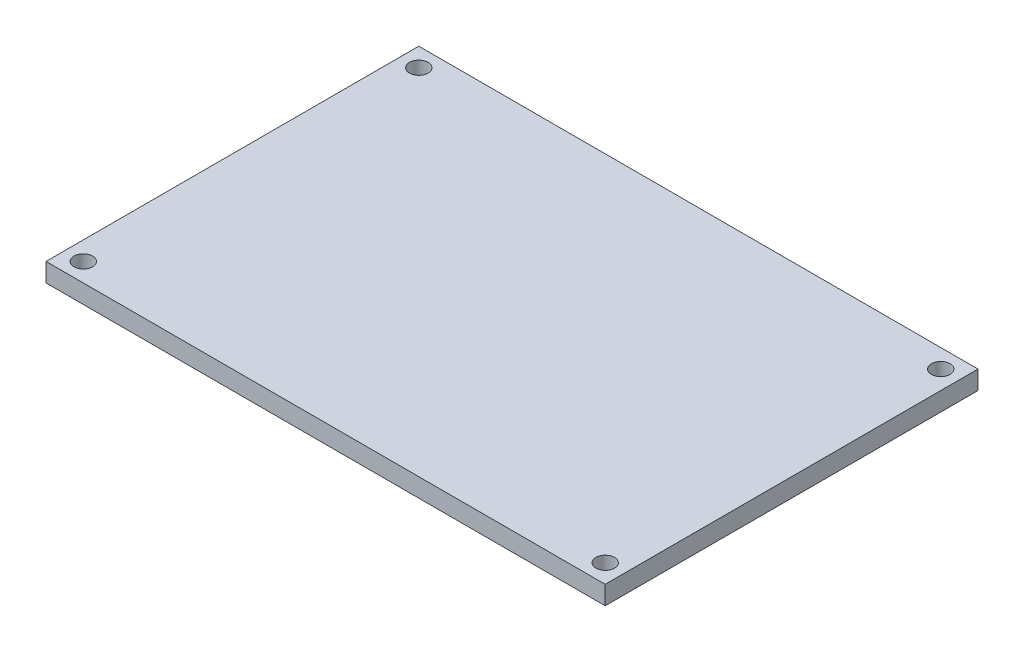
ISO-10303-21;
HEADER;
FILE_DESCRIPTION(('STEP AP214'),'2;1');
FILE_NAME('part.step','',(''),(''),'','','');
FILE_SCHEMA(('AUTOMOTIVE_DESIGN { 1 0 10303 214 1 1 1 1 }'));
ENDSEC;
DATA;
#1=APPLICATION_CONTEXT('core data for automotive mechanical design processes');
#2=APPLICATION_PROTOCOL_DEFINITION('international standard','automotive_design',2000,#1);
#3=PRODUCT_CONTEXT('',#1,'mechanical');
#4=PRODUCT('Part','Part','',(#3));
#5=PRODUCT_RELATED_PRODUCT_CATEGORY('part','',(#4));
#6=PRODUCT_DEFINITION_FORMATION('','',#4);
#7=PRODUCT_DEFINITION_CONTEXT('part definition',#1,'design');
#8=PRODUCT_DEFINITION('design','',#6,#7);
#9=PRODUCT_DEFINITION_SHAPE('','',#8);
#10=(LENGTH_UNIT() NAMED_UNIT(*) SI_UNIT(.MILLI.,.METRE.));
#11=(NAMED_UNIT(*) PLANE_ANGLE_UNIT() SI_UNIT($,.RADIAN.));
#12=(NAMED_UNIT(*) SI_UNIT($,.STERADIAN.) SOLID_ANGLE_UNIT());
#13=UNCERTAINTY_MEASURE_WITH_UNIT(LENGTH_MEASURE(1.E-05),#10,'distance_accuracy_value','');
#14=(GEOMETRIC_REPRESENTATION_CONTEXT(3) GLOBAL_UNCERTAINTY_ASSIGNED_CONTEXT((#13)) GLOBAL_UNIT_ASSIGNED_CONTEXT((#10,
#11,#12)) REPRESENTATION_CONTEXT('',''));
#15=CARTESIAN_POINT('',(0.,0.,0.));
#16=DIRECTION('',(0.,0.,1.));
#17=DIRECTION('',(1.,0.,0.));
#18=AXIS2_PLACEMENT_3D('',#15,#16,#17);
#19=CARTESIAN_POINT('',(0.,2.,0.));
#20=DIRECTION('',(1.,0.,0.));
#21=DIRECTION('',(0.,0.,-1.));
#22=AXIS2_PLACEMENT_3D('',#19,#20,#21);
#23=PLANE('',#22);
#24=DIRECTION('',(0.,0.,1.));
#25=VECTOR('',#24,1.);
#26=CARTESIAN_POINT('',(0.,0.,0.));
#27=LINE('',#26,#25);
#28=CARTESIAN_POINT('',(0.,0.,-40.));
#29=VERTEX_POINT('',#28);
#30=CARTESIAN_POINT('',(0.,0.,0.));
#31=VERTEX_POINT('',#30);
#32=EDGE_CURVE('E95',#29,#31,#27,.T.);
#33=ORIENTED_EDGE('',*,*,#32,.T.);
#34=DIRECTION('',(0.,-1.,0.));
#35=VECTOR('',#34,1.);
#36=CARTESIAN_POINT('',(0.,2.,0.));
#37=LINE('',#36,#35);
#38=CARTESIAN_POINT('',(0.,2.,0.));
#39=VERTEX_POINT('',#38);
#40=EDGE_CURVE('E11',#39,#31,#37,.T.);
#41=ORIENTED_EDGE('',*,*,#40,.F.);
#42=DIRECTION('',(0.,0.,1.));
#43=VECTOR('',#42,1.);
#44=CARTESIAN_POINT('',(0.,2.,0.));
#45=LINE('',#44,#43);
#46=CARTESIAN_POINT('',(0.,2.,-40.));
#47=VERTEX_POINT('',#46);
#48=EDGE_CURVE('E83',#47,#39,#45,.T.);
#49=ORIENTED_EDGE('',*,*,#48,.F.);
#50=DIRECTION('',(0.,-1.,0.));
#51=VECTOR('',#50,1.);
#52=CARTESIAN_POINT('',(0.,2.,-40.));
#53=LINE('',#52,#51);
#54=EDGE_CURVE('E91',#47,#29,#53,.T.);
#55=ORIENTED_EDGE('',*,*,#54,.T.);
#56=EDGE_LOOP('',(#33,#41,#49,#55));
#57=FACE_BOUND('',#56,.T.);
#58=ADVANCED_FACE('F32',(#57),#23,.F.);
#59=CARTESIAN_POINT('',(0.,2.,0.));
#60=DIRECTION('',(0.,0.,-1.));
#61=DIRECTION('',(-1.,0.,0.));
#62=AXIS2_PLACEMENT_3D('',#59,#60,#61);
#63=PLANE('',#62);
#64=DIRECTION('',(1.,0.,0.));
#65=VECTOR('',#64,1.);
#66=CARTESIAN_POINT('',(0.,0.,0.));
#67=LINE('',#66,#65);
#68=CARTESIAN_POINT('',(60.,0.,0.));
#69=VERTEX_POINT('',#68);
#70=EDGE_CURVE('E87',#31,#69,#67,.T.);
#71=ORIENTED_EDGE('',*,*,#70,.T.);
#72=DIRECTION('',(0.,-1.,0.));
#73=VECTOR('',#72,1.);
#74=CARTESIAN_POINT('',(60.,2.,0.));
#75=LINE('',#74,#73);
#76=CARTESIAN_POINT('',(60.,2.,0.));
#77=VERTEX_POINT('',#76);
#78=EDGE_CURVE('E40',#77,#69,#75,.T.);
#79=ORIENTED_EDGE('',*,*,#78,.F.);
#80=DIRECTION('',(1.,0.,0.));
#81=VECTOR('',#80,1.);
#82=CARTESIAN_POINT('',(0.,2.,0.));
#83=LINE('',#82,#81);
#84=EDGE_CURVE('E78',#39,#77,#83,.T.);
#85=ORIENTED_EDGE('',*,*,#84,.F.);
#86=ORIENTED_EDGE('',*,*,#40,.T.);
#87=EDGE_LOOP('',(#71,#79,#85,#86));
#88=FACE_BOUND('',#87,.T.);
#89=ADVANCED_FACE('F86',(#88),#63,.F.);
#90=CARTESIAN_POINT('',(60.,2.,0.));
#91=DIRECTION('',(-1.,0.,0.));
#92=DIRECTION('',(0.,0.,1.));
#93=AXIS2_PLACEMENT_3D('',#90,#91,#92);
#94=PLANE('',#93);
#95=DIRECTION('',(0.,0.,-1.));
#96=VECTOR('',#95,1.);
#97=CARTESIAN_POINT('',(60.,0.,0.));
#98=LINE('',#97,#96);
#99=CARTESIAN_POINT('',(60.,0.,-40.));
#100=VERTEX_POINT('',#99);
#101=EDGE_CURVE('E65',#69,#100,#98,.T.);
#102=ORIENTED_EDGE('',*,*,#101,.T.);
#103=DIRECTION('',(0.,-1.,0.));
#104=VECTOR('',#103,1.);
#105=CARTESIAN_POINT('',(60.,2.,-40.));
#106=LINE('',#105,#104);
#107=CARTESIAN_POINT('',(60.,2.,-40.));
#108=VERTEX_POINT('',#107);
#109=EDGE_CURVE('E88',#108,#100,#106,.T.);
#110=ORIENTED_EDGE('',*,*,#109,.F.);
#111=DIRECTION('',(0.,0.,-1.));
#112=VECTOR('',#111,1.);
#113=CARTESIAN_POINT('',(60.,2.,0.));
#114=LINE('',#113,#112);
#115=EDGE_CURVE('E81',#77,#108,#114,.T.);
#116=ORIENTED_EDGE('',*,*,#115,.F.);
#117=ORIENTED_EDGE('',*,*,#78,.T.);
#118=EDGE_LOOP('',(#102,#110,#116,#117));
#119=FACE_BOUND('',#118,.T.);
#120=ADVANCED_FACE('F89',(#119),#94,.F.);
#121=CARTESIAN_POINT('',(0.,2.,-40.));
#122=DIRECTION('',(0.,0.,1.));
#123=DIRECTION('',(1.,0.,0.));
#124=AXIS2_PLACEMENT_3D('',#121,#122,#123);
#125=PLANE('',#124);
#126=DIRECTION('',(-1.,0.,0.));
#127=VECTOR('',#126,1.);
#128=CARTESIAN_POINT('',(0.,0.,-40.));
#129=LINE('',#128,#127);
#130=EDGE_CURVE('E71',#100,#29,#129,.T.);
#131=ORIENTED_EDGE('',*,*,#130,.T.);
#132=ORIENTED_EDGE('',*,*,#54,.F.);
#133=DIRECTION('',(-1.,0.,0.));
#134=VECTOR('',#133,1.);
#135=CARTESIAN_POINT('',(0.,2.,-40.));
#136=LINE('',#135,#134);
#137=EDGE_CURVE('E48',#108,#47,#136,.T.);
#138=ORIENTED_EDGE('',*,*,#137,.F.);
#139=ORIENTED_EDGE('',*,*,#109,.T.);
#140=EDGE_LOOP('',(#131,#132,#138,#139));
#141=FACE_BOUND('',#140,.T.);
#142=ADVANCED_FACE('F103',(#141),#125,.F.);
#143=CARTESIAN_POINT('',(0.,2.,0.));
#144=DIRECTION('',(0.,-1.,0.));
#145=DIRECTION('',(0.,0.,-1.));
#146=AXIS2_PLACEMENT_3D('',#143,#144,#145);
#147=PLANE('',#146);
#148=CARTESIAN_POINT('',(58.,2.,-38.));
#149=DIRECTION('',(0.,1.,0.));
#150=DIRECTION('',(0.,0.,1.));
#151=AXIS2_PLACEMENT_3D('',#148,#149,#150);
#152=CIRCLE('',#151,0.999999999999998);
#153=CARTESIAN_POINT('',(58.,2.,-37.));
#154=VERTEX_POINT('',#153);
#155=EDGE_CURVE('E127',#154,#154,#152,.T.);
#156=ORIENTED_EDGE('',*,*,#155,.F.);
#157=EDGE_LOOP('',(#156));
#158=FACE_BOUND('',#157,.T.);
#159=CARTESIAN_POINT('',(58.,2.,-2.));
#160=DIRECTION('',(0.,1.,0.));
#161=DIRECTION('',(0.,0.,1.));
#162=AXIS2_PLACEMENT_3D('',#159,#160,#161);
#163=CIRCLE('',#162,0.999999999999998);
#164=CARTESIAN_POINT('',(58.,2.,-1.));
#165=VERTEX_POINT('',#164);
#166=EDGE_CURVE('E121',#165,#165,#163,.T.);
#167=ORIENTED_EDGE('',*,*,#166,.F.);
#168=EDGE_LOOP('',(#167));
#169=FACE_BOUND('',#168,.T.);
#170=CARTESIAN_POINT('',(2.00000000000001,2.,-2.));
#171=DIRECTION('',(0.,1.,0.));
#172=DIRECTION('',(0.,0.,1.));
#173=AXIS2_PLACEMENT_3D('',#170,#171,#172);
#174=CIRCLE('',#173,1.);
#175=CARTESIAN_POINT('',(2.00000000000001,2.,-1.));
#176=VERTEX_POINT('',#175);
#177=EDGE_CURVE('E115',#176,#176,#174,.T.);
#178=ORIENTED_EDGE('',*,*,#177,.F.);
#179=EDGE_LOOP('',(#178));
#180=FACE_BOUND('',#179,.T.);
#181=CARTESIAN_POINT('',(2.,2.,-38.));
#182=DIRECTION('',(0.,1.,0.));
#183=DIRECTION('',(0.,0.,1.));
#184=AXIS2_PLACEMENT_3D('',#181,#182,#183);
#185=CIRCLE('',#184,1.);
#186=CARTESIAN_POINT('',(2.,2.,-37.));
#187=VERTEX_POINT('',#186);
#188=EDGE_CURVE('E109',#187,#187,#185,.T.);
#189=ORIENTED_EDGE('',*,*,#188,.F.);
#190=EDGE_LOOP('',(#189));
#191=FACE_BOUND('',#190,.T.);
#192=ORIENTED_EDGE('',*,*,#48,.T.);
#193=ORIENTED_EDGE('',*,*,#84,.T.);
#194=ORIENTED_EDGE('',*,*,#115,.T.);
#195=ORIENTED_EDGE('',*,*,#137,.T.);
#196=EDGE_LOOP('',(#192,#193,#194,#195));
#197=FACE_BOUND('',#196,.T.);
#198=ADVANCED_FACE('F79',(#158,#169,#180,#191,#197),#147,.F.);
#199=CARTESIAN_POINT('',(0.,0.,0.));
#200=DIRECTION('',(0.,-1.,0.));
#201=DIRECTION('',(0.,0.,-1.));
#202=AXIS2_PLACEMENT_3D('',#199,#200,#201);
#203=PLANE('',#202);
#204=CARTESIAN_POINT('',(58.,0.,-38.));
#205=DIRECTION('',(0.,1.,0.));
#206=DIRECTION('',(0.,0.,1.));
#207=AXIS2_PLACEMENT_3D('',#204,#205,#206);
#208=CIRCLE('',#207,0.999999999999998);
#209=CARTESIAN_POINT('',(58.,0.,-37.));
#210=VERTEX_POINT('',#209);
#211=EDGE_CURVE('E124',#210,#210,#208,.T.);
#212=ORIENTED_EDGE('',*,*,#211,.T.);
#213=EDGE_LOOP('',(#212));
#214=FACE_BOUND('',#213,.T.);
#215=CARTESIAN_POINT('',(58.,0.,-2.));
#216=DIRECTION('',(0.,1.,0.));
#217=DIRECTION('',(0.,0.,1.));
#218=AXIS2_PLACEMENT_3D('',#215,#216,#217);
#219=CIRCLE('',#218,0.999999999999998);
#220=CARTESIAN_POINT('',(58.,0.,-1.));
#221=VERTEX_POINT('',#220);
#222=EDGE_CURVE('E118',#221,#221,#219,.T.);
#223=ORIENTED_EDGE('',*,*,#222,.T.);
#224=EDGE_LOOP('',(#223));
#225=FACE_BOUND('',#224,.T.);
#226=CARTESIAN_POINT('',(2.00000000000001,0.,-2.));
#227=DIRECTION('',(0.,1.,0.));
#228=DIRECTION('',(0.,0.,1.));
#229=AXIS2_PLACEMENT_3D('',#226,#227,#228);
#230=CIRCLE('',#229,1.);
#231=CARTESIAN_POINT('',(2.00000000000001,0.,-1.));
#232=VERTEX_POINT('',#231);
#233=EDGE_CURVE('E112',#232,#232,#230,.T.);
#234=ORIENTED_EDGE('',*,*,#233,.T.);
#235=EDGE_LOOP('',(#234));
#236=FACE_BOUND('',#235,.T.);
#237=CARTESIAN_POINT('',(2.,0.,-38.));
#238=DIRECTION('',(0.,1.,0.));
#239=DIRECTION('',(0.,0.,1.));
#240=AXIS2_PLACEMENT_3D('',#237,#238,#239);
#241=CIRCLE('',#240,1.);
#242=CARTESIAN_POINT('',(2.,0.,-37.));
#243=VERTEX_POINT('',#242);
#244=EDGE_CURVE('E98',#243,#243,#241,.T.);
#245=ORIENTED_EDGE('',*,*,#244,.T.);
#246=EDGE_LOOP('',(#245));
#247=FACE_BOUND('',#246,.T.);
#248=ORIENTED_EDGE('',*,*,#32,.F.);
#249=ORIENTED_EDGE('',*,*,#130,.F.);
#250=ORIENTED_EDGE('',*,*,#101,.F.);
#251=ORIENTED_EDGE('',*,*,#70,.F.);
#252=EDGE_LOOP('',(#248,#249,#250,#251));
#253=FACE_BOUND('',#252,.T.);
#254=ADVANCED_FACE('F106',(#214,#225,#236,#247,#253),#203,.T.);
#255=CARTESIAN_POINT('',(2.,0.,-38.));
#256=DIRECTION('',(0.,1.,0.));
#257=DIRECTION('',(0.,0.,1.));
#258=AXIS2_PLACEMENT_3D('',#255,#256,#257);
#259=CYLINDRICAL_SURFACE('',#258,1.);
#260=ORIENTED_EDGE('',*,*,#244,.F.);
#261=EDGE_LOOP('',(#260));
#262=FACE_BOUND('',#261,.T.);
#263=ORIENTED_EDGE('',*,*,#188,.T.);
#264=EDGE_LOOP('',(#263));
#265=FACE_BOUND('',#264,.T.);
#266=ADVANCED_FACE('F151',(#262,#265),#259,.F.);
#267=CARTESIAN_POINT('',(2.00000000000001,0.,-2.));
#268=DIRECTION('',(0.,1.,0.));
#269=DIRECTION('',(0.,0.,1.));
#270=AXIS2_PLACEMENT_3D('',#267,#268,#269);
#271=CYLINDRICAL_SURFACE('',#270,1.);
#272=ORIENTED_EDGE('',*,*,#233,.F.);
#273=EDGE_LOOP('',(#272));
#274=FACE_BOUND('',#273,.T.);
#275=ORIENTED_EDGE('',*,*,#177,.T.);
#276=EDGE_LOOP('',(#275));
#277=FACE_BOUND('',#276,.T.);
#278=ADVANCED_FACE('F153',(#274,#277),#271,.F.);
#279=CARTESIAN_POINT('',(58.,0.,-2.));
#280=DIRECTION('',(0.,1.,0.));
#281=DIRECTION('',(0.,0.,1.));
#282=AXIS2_PLACEMENT_3D('',#279,#280,#281);
#283=CYLINDRICAL_SURFACE('',#282,0.999999999999998);
#284=ORIENTED_EDGE('',*,*,#222,.F.);
#285=EDGE_LOOP('',(#284));
#286=FACE_BOUND('',#285,.T.);
#287=ORIENTED_EDGE('',*,*,#166,.T.);
#288=EDGE_LOOP('',(#287));
#289=FACE_BOUND('',#288,.T.);
#290=ADVANCED_FACE('F138',(#286,#289),#283,.F.);
#291=CARTESIAN_POINT('',(58.,0.,-38.));
#292=DIRECTION('',(0.,1.,0.));
#293=DIRECTION('',(0.,0.,1.));
#294=AXIS2_PLACEMENT_3D('',#291,#292,#293);
#295=CYLINDRICAL_SURFACE('',#294,0.999999999999998);
#296=ORIENTED_EDGE('',*,*,#211,.F.);
#297=EDGE_LOOP('',(#296));
#298=FACE_BOUND('',#297,.T.);
#299=ORIENTED_EDGE('',*,*,#155,.T.);
#300=EDGE_LOOP('',(#299));
#301=FACE_BOUND('',#300,.T.);
#302=ADVANCED_FACE('F135',(#298,#301),#295,.F.);
#303=CLOSED_SHELL('',(#58,#89,#120,#142,#198,#254,#266,#278,#290,#302));
#304=MANIFOLD_SOLID_BREP('B2',#303);
#305=ADVANCED_BREP_SHAPE_REPRESENTATION('',(#18,#304),#14);
#306=SHAPE_DEFINITION_REPRESENTATION(#9,#305);
ENDSEC;
END-ISO-10303-21;
